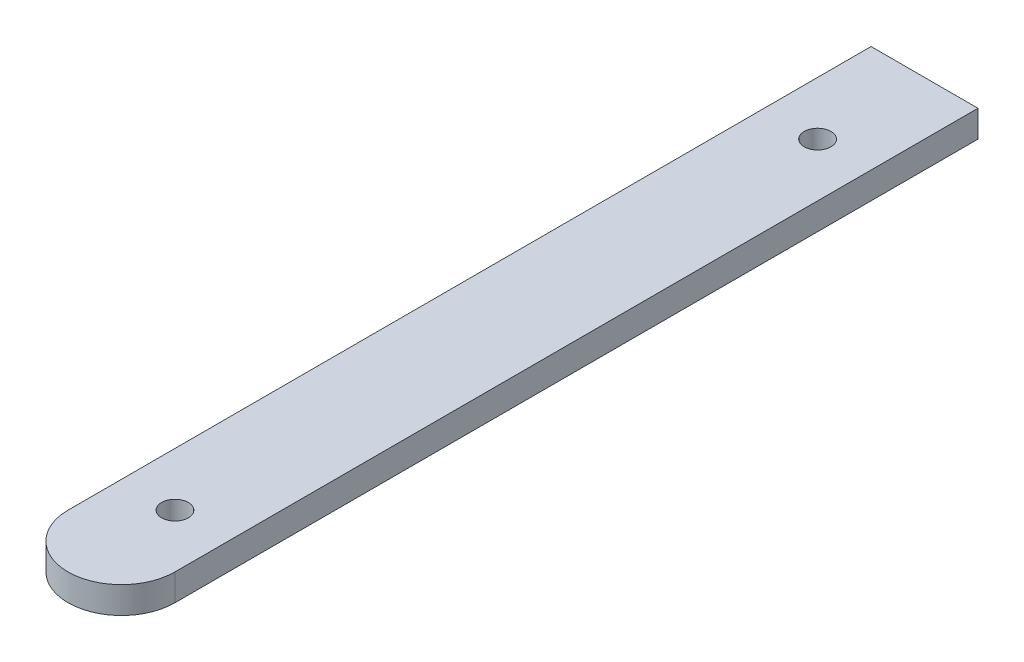
ISO-10303-21;
HEADER;
FILE_DESCRIPTION(('STEP AP214'),'2;1');
FILE_NAME('part.step','',(''),(''),'','','');
FILE_SCHEMA(('AUTOMOTIVE_DESIGN { 1 0 10303 214 1 1 1 1 }'));
ENDSEC;
DATA;
#1=APPLICATION_CONTEXT('core data for automotive mechanical design processes');
#2=APPLICATION_PROTOCOL_DEFINITION('international standard','automotive_design',2000,#1);
#3=PRODUCT_CONTEXT('',#1,'mechanical');
#4=PRODUCT('Part','Part','',(#3));
#5=PRODUCT_RELATED_PRODUCT_CATEGORY('part','',(#4));
#6=PRODUCT_DEFINITION_FORMATION('','',#4);
#7=PRODUCT_DEFINITION_CONTEXT('part definition',#1,'design');
#8=PRODUCT_DEFINITION('design','',#6,#7);
#9=PRODUCT_DEFINITION_SHAPE('','',#8);
#10=(LENGTH_UNIT() NAMED_UNIT(*) SI_UNIT(.MILLI.,.METRE.));
#11=(NAMED_UNIT(*) PLANE_ANGLE_UNIT() SI_UNIT($,.RADIAN.));
#12=(NAMED_UNIT(*) SI_UNIT($,.STERADIAN.) SOLID_ANGLE_UNIT());
#13=UNCERTAINTY_MEASURE_WITH_UNIT(LENGTH_MEASURE(1.E-05),#10,'distance_accuracy_value','');
#14=(GEOMETRIC_REPRESENTATION_CONTEXT(3) GLOBAL_UNCERTAINTY_ASSIGNED_CONTEXT((#13)) GLOBAL_UNIT_ASSIGNED_CONTEXT((#10,
#11,#12)) REPRESENTATION_CONTEXT('',''));
#15=CARTESIAN_POINT('',(0.,0.,0.));
#16=DIRECTION('',(0.,0.,1.));
#17=DIRECTION('',(1.,0.,0.));
#18=AXIS2_PLACEMENT_3D('',#15,#16,#17);
#19=CARTESIAN_POINT('',(6.29663865546221,0.,162.685932773109));
#20=DIRECTION('',(0.,-1.,0.));
#21=DIRECTION('',(0.,0.,-1.));
#22=AXIS2_PLACEMENT_3D('',#19,#20,#21);
#23=CYLINDRICAL_SURFACE('',#22,12.7);
#24=DIRECTION('',(0.,-1.,0.));
#25=VECTOR('',#24,1.);
#26=CARTESIAN_POINT('',(-6.40336134453779,6.35,162.685932773109));
#27=LINE('',#26,#25);
#28=CARTESIAN_POINT('',(-6.40336134453779,0.,162.685932773109));
#29=VERTEX_POINT('',#28);
#30=CARTESIAN_POINT('',(-6.40336134453779,6.35,162.685932773109));
#31=VERTEX_POINT('',#30);
#32=EDGE_CURVE('E103',#29,#31,#27,.F.);
#33=ORIENTED_EDGE('',*,*,#32,.F.);
#34=CARTESIAN_POINT('',(6.29663865546221,0.,162.685932773109));
#35=DIRECTION('',(0.,1.,0.));
#36=DIRECTION('',(0.,0.,1.));
#37=AXIS2_PLACEMENT_3D('',#34,#35,#36);
#38=CIRCLE('',#37,12.7);
#39=CARTESIAN_POINT('',(18.9966386554622,0.,162.685932773109));
#40=VERTEX_POINT('',#39);
#41=EDGE_CURVE('E56',#40,#29,#38,.F.);
#42=ORIENTED_EDGE('',*,*,#41,.F.);
#43=DIRECTION('',(0.,-1.,0.));
#44=VECTOR('',#43,1.);
#45=CARTESIAN_POINT('',(18.9966386554622,6.35,162.685932773109));
#46=LINE('',#45,#44);
#47=CARTESIAN_POINT('',(18.9966386554622,6.35,162.685932773109));
#48=VERTEX_POINT('',#47);
#49=EDGE_CURVE('E128',#48,#40,#46,.T.);
#50=ORIENTED_EDGE('',*,*,#49,.F.);
#51=CARTESIAN_POINT('',(6.29663865546221,6.35,162.685932773109));
#52=DIRECTION('',(0.,1.,0.));
#53=DIRECTION('',(0.,0.,1.));
#54=AXIS2_PLACEMENT_3D('',#51,#52,#53);
#55=CIRCLE('',#54,12.7);
#56=EDGE_CURVE('E11',#31,#48,#55,.T.);
#57=ORIENTED_EDGE('',*,*,#56,.F.);
#58=EDGE_LOOP('',(#33,#42,#50,#57));
#59=FACE_BOUND('',#58,.T.);
#60=ADVANCED_FACE('F47',(#59),#23,.T.);
#61=CARTESIAN_POINT('',(0.,6.35,0.));
#62=DIRECTION('',(0.,1.,0.));
#63=DIRECTION('',(0.,0.,1.));
#64=AXIS2_PLACEMENT_3D('',#61,#62,#63);
#65=PLANE('',#64);
#66=CARTESIAN_POINT('',(6.29663865546219,6.35,-2.66806722689079));
#67=DIRECTION('',(0.,1.,0.));
#68=DIRECTION('',(0.,0.,1.));
#69=AXIS2_PLACEMENT_3D('',#66,#67,#68);
#70=CIRCLE('',#69,3.175);
#71=CARTESIAN_POINT('',(6.29663865546219,6.35,0.506932773109214));
#72=VERTEX_POINT('',#71);
#73=EDGE_CURVE('E119',#72,#72,#70,.T.);
#74=ORIENTED_EDGE('',*,*,#73,.F.);
#75=EDGE_LOOP('',(#74));
#76=FACE_BOUND('',#75,.T.);
#77=DIRECTION('',(0.,0.,1.));
#78=VECTOR('',#77,1.);
#79=CARTESIAN_POINT('',(-6.4033613445378,6.35,-28.0680672268908));
#80=LINE('',#79,#78);
#81=CARTESIAN_POINT('',(-6.4033613445378,6.35,-28.0680672268908));
#82=VERTEX_POINT('',#81);
#83=EDGE_CURVE('E93',#82,#31,#80,.T.);
#84=ORIENTED_EDGE('',*,*,#83,.T.);
#85=ORIENTED_EDGE('',*,*,#56,.T.);
#86=DIRECTION('',(0.,0.,-1.));
#87=VECTOR('',#86,1.);
#88=CARTESIAN_POINT('',(18.9966386554622,6.35,-28.0680672268908));
#89=LINE('',#88,#87);
#90=CARTESIAN_POINT('',(18.9966386554622,6.35,-28.0680672268908));
#91=VERTEX_POINT('',#90);
#92=EDGE_CURVE('E84',#48,#91,#89,.T.);
#93=ORIENTED_EDGE('',*,*,#92,.T.);
#94=DIRECTION('',(-1.,0.,0.));
#95=VECTOR('',#94,1.);
#96=CARTESIAN_POINT('',(-6.4033613445378,6.35,-28.0680672268908));
#97=LINE('',#96,#95);
#98=EDGE_CURVE('E89',#91,#82,#97,.T.);
#99=ORIENTED_EDGE('',*,*,#98,.T.);
#100=EDGE_LOOP('',(#84,#85,#93,#99));
#101=FACE_BOUND('',#100,.T.);
#102=CARTESIAN_POINT('',(6.29663865546219,6.35,149.985932773109));
#103=DIRECTION('',(0.,1.,0.));
#104=DIRECTION('',(0.,0.,1.));
#105=AXIS2_PLACEMENT_3D('',#102,#103,#104);
#106=CIRCLE('',#105,3.175);
#107=CARTESIAN_POINT('',(6.29663865546219,6.35,153.160932773109));
#108=VERTEX_POINT('',#107);
#109=EDGE_CURVE('E143',#108,#108,#106,.T.);
#110=ORIENTED_EDGE('',*,*,#109,.F.);
#111=EDGE_LOOP('',(#110));
#112=FACE_BOUND('',#111,.T.);
#113=ADVANCED_FACE('F86',(#76,#101,#112),#65,.T.);
#114=CARTESIAN_POINT('',(0.,0.,0.));
#115=DIRECTION('',(0.,1.,0.));
#116=DIRECTION('',(0.,0.,1.));
#117=AXIS2_PLACEMENT_3D('',#114,#115,#116);
#118=PLANE('',#117);
#119=DIRECTION('',(0.,0.,-1.));
#120=VECTOR('',#119,1.);
#121=CARTESIAN_POINT('',(18.9966386554622,0.,-28.0680672268908));
#122=LINE('',#121,#120);
#123=CARTESIAN_POINT('',(18.9966386554622,0.,-28.0680672268908));
#124=VERTEX_POINT('',#123);
#125=EDGE_CURVE('E99',#40,#124,#122,.T.);
#126=ORIENTED_EDGE('',*,*,#125,.F.);
#127=ORIENTED_EDGE('',*,*,#41,.T.);
#128=DIRECTION('',(0.,0.,1.));
#129=VECTOR('',#128,1.);
#130=CARTESIAN_POINT('',(-6.4033613445378,0.,-28.0680672268908));
#131=LINE('',#130,#129);
#132=CARTESIAN_POINT('',(-6.4033613445378,0.,-28.0680672268908));
#133=VERTEX_POINT('',#132);
#134=EDGE_CURVE('E115',#133,#29,#131,.T.);
#135=ORIENTED_EDGE('',*,*,#134,.F.);
#136=DIRECTION('',(-1.,0.,0.));
#137=VECTOR('',#136,1.);
#138=CARTESIAN_POINT('',(-6.4033613445378,0.,-28.0680672268908));
#139=LINE('',#138,#137);
#140=EDGE_CURVE('E122',#124,#133,#139,.T.);
#141=ORIENTED_EDGE('',*,*,#140,.F.);
#142=EDGE_LOOP('',(#126,#127,#135,#141));
#143=FACE_BOUND('',#142,.T.);
#144=CARTESIAN_POINT('',(6.29663865546219,0.,-2.66806722689079));
#145=DIRECTION('',(0.,1.,0.));
#146=DIRECTION('',(0.,0.,1.));
#147=AXIS2_PLACEMENT_3D('',#144,#145,#146);
#148=CIRCLE('',#147,3.175);
#149=CARTESIAN_POINT('',(6.29663865546219,0.,0.506932773109214));
#150=VERTEX_POINT('',#149);
#151=EDGE_CURVE('E139',#150,#150,#148,.T.);
#152=ORIENTED_EDGE('',*,*,#151,.T.);
#153=EDGE_LOOP('',(#152));
#154=FACE_BOUND('',#153,.T.);
#155=CARTESIAN_POINT('',(6.29663865546219,0.,149.985932773109));
#156=DIRECTION('',(0.,1.,0.));
#157=DIRECTION('',(0.,0.,1.));
#158=AXIS2_PLACEMENT_3D('',#155,#156,#157);
#159=CIRCLE('',#158,3.175);
#160=CARTESIAN_POINT('',(6.29663865546219,0.,153.160932773109));
#161=VERTEX_POINT('',#160);
#162=EDGE_CURVE('E147',#161,#161,#159,.T.);
#163=ORIENTED_EDGE('',*,*,#162,.T.);
#164=EDGE_LOOP('',(#163));
#165=FACE_BOUND('',#164,.T.);
#166=ADVANCED_FACE('F133',(#143,#154,#165),#118,.F.);
#167=CARTESIAN_POINT('',(-6.4033613445378,6.35,-28.0680672268908));
#168=DIRECTION('',(1.,0.,0.));
#169=DIRECTION('',(0.,0.,-1.));
#170=AXIS2_PLACEMENT_3D('',#167,#168,#169);
#171=PLANE('',#170);
#172=ORIENTED_EDGE('',*,*,#134,.T.);
#173=ORIENTED_EDGE('',*,*,#32,.T.);
#174=ORIENTED_EDGE('',*,*,#83,.F.);
#175=DIRECTION('',(0.,-1.,0.));
#176=VECTOR('',#175,1.);
#177=CARTESIAN_POINT('',(-6.4033613445378,6.35,-28.0680672268908));
#178=LINE('',#177,#176);
#179=EDGE_CURVE('E104',#82,#133,#178,.T.);
#180=ORIENTED_EDGE('',*,*,#179,.T.);
#181=EDGE_LOOP('',(#172,#173,#174,#180));
#182=FACE_BOUND('',#181,.T.);
#183=ADVANCED_FACE('F136',(#182),#171,.F.);
#184=CARTESIAN_POINT('',(18.9966386554622,6.35,-28.0680672268908));
#185=DIRECTION('',(-1.,0.,0.));
#186=DIRECTION('',(0.,0.,1.));
#187=AXIS2_PLACEMENT_3D('',#184,#185,#186);
#188=PLANE('',#187);
#189=ORIENTED_EDGE('',*,*,#92,.F.);
#190=ORIENTED_EDGE('',*,*,#49,.T.);
#191=ORIENTED_EDGE('',*,*,#125,.T.);
#192=DIRECTION('',(0.,-1.,0.));
#193=VECTOR('',#192,1.);
#194=CARTESIAN_POINT('',(18.9966386554622,6.35,-28.0680672268908));
#195=LINE('',#194,#193);
#196=EDGE_CURVE('E96',#91,#124,#195,.T.);
#197=ORIENTED_EDGE('',*,*,#196,.F.);
#198=EDGE_LOOP('',(#189,#190,#191,#197));
#199=FACE_BOUND('',#198,.T.);
#200=ADVANCED_FACE('F97',(#199),#188,.F.);
#201=CARTESIAN_POINT('',(-6.4033613445378,6.35,-28.0680672268908));
#202=DIRECTION('',(0.,0.,1.));
#203=DIRECTION('',(1.,0.,0.));
#204=AXIS2_PLACEMENT_3D('',#201,#202,#203);
#205=PLANE('',#204);
#206=ORIENTED_EDGE('',*,*,#140,.T.);
#207=ORIENTED_EDGE('',*,*,#179,.F.);
#208=ORIENTED_EDGE('',*,*,#98,.F.);
#209=ORIENTED_EDGE('',*,*,#196,.T.);
#210=EDGE_LOOP('',(#206,#207,#208,#209));
#211=FACE_BOUND('',#210,.T.);
#212=ADVANCED_FACE('F106',(#211),#205,.F.);
#213=CARTESIAN_POINT('',(6.29663865546219,6.35,-2.66806722689079));
#214=DIRECTION('',(0.,-1.,0.));
#215=DIRECTION('',(0.,0.,-1.));
#216=AXIS2_PLACEMENT_3D('',#213,#214,#215);
#217=CYLINDRICAL_SURFACE('',#216,3.175);
#218=ORIENTED_EDGE('',*,*,#73,.T.);
#219=EDGE_LOOP('',(#218));
#220=FACE_BOUND('',#219,.T.);
#221=ORIENTED_EDGE('',*,*,#151,.F.);
#222=EDGE_LOOP('',(#221));
#223=FACE_BOUND('',#222,.T.);
#224=ADVANCED_FACE('F167',(#220,#223),#217,.F.);
#225=CARTESIAN_POINT('',(6.29663865546219,6.35,149.985932773109));
#226=DIRECTION('',(0.,-1.,0.));
#227=DIRECTION('',(0.,0.,-1.));
#228=AXIS2_PLACEMENT_3D('',#225,#226,#227);
#229=CYLINDRICAL_SURFACE('',#228,3.175);
#230=ORIENTED_EDGE('',*,*,#109,.T.);
#231=EDGE_LOOP('',(#230));
#232=FACE_BOUND('',#231,.T.);
#233=ORIENTED_EDGE('',*,*,#162,.F.);
#234=EDGE_LOOP('',(#233));
#235=FACE_BOUND('',#234,.T.);
#236=ADVANCED_FACE('F155',(#232,#235),#229,.F.);
#237=CLOSED_SHELL('',(#60,#113,#166,#183,#200,#212,#224,#236));
#238=MANIFOLD_SOLID_BREP('B2',#237);
#239=ADVANCED_BREP_SHAPE_REPRESENTATION('',(#18,#238),#14);
#240=SHAPE_DEFINITION_REPRESENTATION(#9,#239);
ENDSEC;
END-ISO-10303-21;
